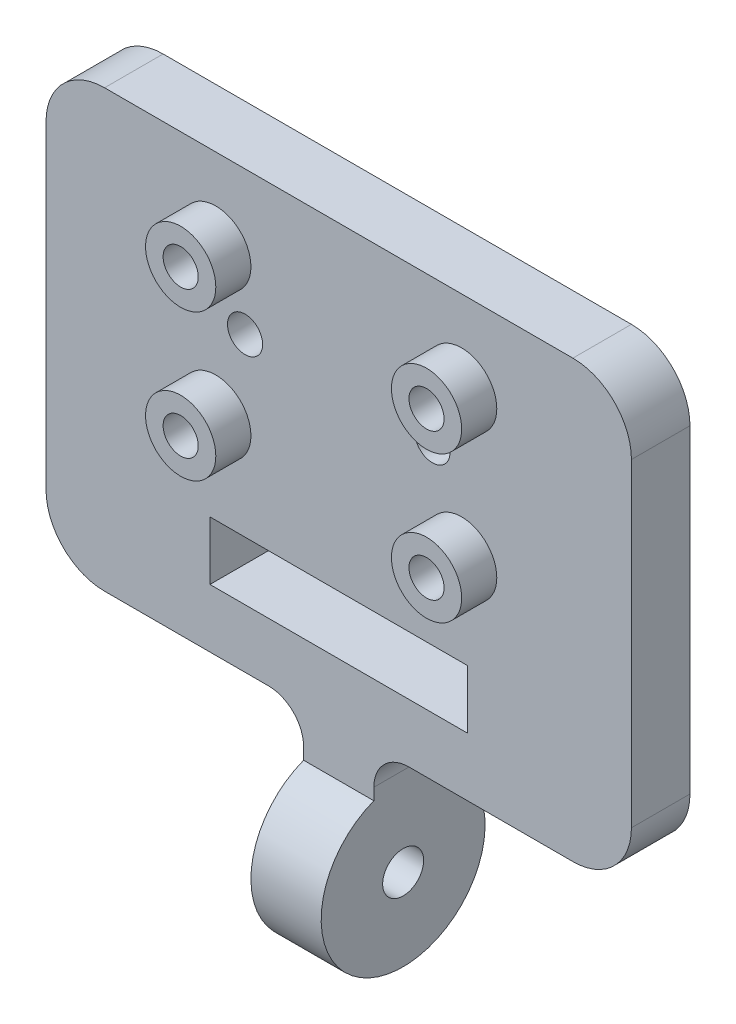
ISO-10303-21;
HEADER;
FILE_DESCRIPTION(('STEP AP214'),'2;1');
FILE_NAME('part.step','',(''),(''),'','','');
FILE_SCHEMA(('AUTOMOTIVE_DESIGN { 1 0 10303 214 1 1 1 1 }'));
ENDSEC;
DATA;
#1=APPLICATION_CONTEXT('core data for automotive mechanical design processes');
#2=APPLICATION_PROTOCOL_DEFINITION('international standard','automotive_design',2000,#1);
#3=PRODUCT_CONTEXT('',#1,'mechanical');
#4=PRODUCT('Part','Part','',(#3));
#5=PRODUCT_RELATED_PRODUCT_CATEGORY('part','',(#4));
#6=PRODUCT_DEFINITION_FORMATION('','',#4);
#7=PRODUCT_DEFINITION_CONTEXT('part definition',#1,'design');
#8=PRODUCT_DEFINITION('design','',#6,#7);
#9=PRODUCT_DEFINITION_SHAPE('','',#8);
#10=(LENGTH_UNIT() NAMED_UNIT(*) SI_UNIT(.MILLI.,.METRE.));
#11=(NAMED_UNIT(*) PLANE_ANGLE_UNIT() SI_UNIT($,.RADIAN.));
#12=(NAMED_UNIT(*) SI_UNIT($,.STERADIAN.) SOLID_ANGLE_UNIT());
#13=UNCERTAINTY_MEASURE_WITH_UNIT(LENGTH_MEASURE(1.E-05),#10,'distance_accuracy_value','');
#14=(GEOMETRIC_REPRESENTATION_CONTEXT(3) GLOBAL_UNCERTAINTY_ASSIGNED_CONTEXT((#13)) GLOBAL_UNIT_ASSIGNED_CONTEXT((#10,
#11,#12)) REPRESENTATION_CONTEXT('',''));
#15=CARTESIAN_POINT('',(0.,0.,0.));
#16=DIRECTION('',(0.,0.,1.));
#17=DIRECTION('',(1.,0.,0.));
#18=AXIS2_PLACEMENT_3D('',#15,#16,#17);
#19=CARTESIAN_POINT('',(-11.1229946524064,-36.2352941176471,5.));
#20=DIRECTION('',(0.,1.,0.));
#21=DIRECTION('',(0.,0.,1.));
#22=AXIS2_PLACEMENT_3D('',#19,#20,#21);
#23=PLANE('',#22);
#24=DIRECTION('',(1.,0.,0.));
#25=VECTOR('',#24,1.);
#26=CARTESIAN_POINT('',(-11.1229946524064,-36.2352941176471,5.));
#27=LINE('',#26,#25);
#28=CARTESIAN_POINT('',(19.8770053475936,-36.2352941176471,5.));
#29=VERTEX_POINT('',#28);
#30=CARTESIAN_POINT('',(33.8770053475936,-36.2352941176471,5.));
#31=VERTEX_POINT('',#30);
#32=EDGE_CURVE('E315',#29,#31,#27,.T.);
#33=ORIENTED_EDGE('',*,*,#32,.F.);
#34=DIRECTION('',(0.,0.,1.));
#35=VECTOR('',#34,1.);
#36=CARTESIAN_POINT('',(19.8770053475936,-36.2352941176471,0.));
#37=LINE('',#36,#35);
#38=CARTESIAN_POINT('',(19.8770053475936,-36.2352941176471,0.));
#39=VERTEX_POINT('',#38);
#40=EDGE_CURVE('E405',#29,#39,#37,.F.);
#41=ORIENTED_EDGE('',*,*,#40,.T.);
#42=DIRECTION('',(1.,0.,0.));
#43=VECTOR('',#42,1.);
#44=CARTESIAN_POINT('',(-11.1229946524064,-36.2352941176471,0.));
#45=LINE('',#44,#43);
#46=CARTESIAN_POINT('',(33.8770053475936,-36.2352941176471,0.));
#47=VERTEX_POINT('',#46);
#48=EDGE_CURVE('E329',#39,#47,#45,.T.);
#49=ORIENTED_EDGE('',*,*,#48,.T.);
#50=DIRECTION('',(0.,0.,-1.));
#51=VECTOR('',#50,1.);
#52=CARTESIAN_POINT('',(33.8770053475936,-36.2352941176471,5.));
#53=LINE('',#52,#51);
#54=EDGE_CURVE('E361',#47,#31,#53,.F.);
#55=ORIENTED_EDGE('',*,*,#54,.T.);
#56=EDGE_LOOP('',(#33,#41,#49,#55));
#57=FACE_BOUND('',#56,.T.);
#58=ADVANCED_FACE('F41',(#57),#23,.F.);
#59=CARTESIAN_POINT('',(-6.12299465240641,-36.2352941176471,0.));
#60=VERTEX_POINT('',#59);
#61=CARTESIAN_POINT('',(7.87700534759359,-36.2352941176471,0.));
#62=VERTEX_POINT('',#61);
#63=EDGE_CURVE('E330',#60,#62,#45,.T.);
#64=ORIENTED_EDGE('',*,*,#63,.T.);
#65=DIRECTION('',(0.,0.,-1.));
#66=VECTOR('',#65,1.);
#67=CARTESIAN_POINT('',(7.87700534759358,-36.2352941176471,5.));
#68=LINE('',#67,#66);
#69=CARTESIAN_POINT('',(7.87700534759358,-36.2352941176471,5.));
#70=VERTEX_POINT('',#69);
#71=EDGE_CURVE('E398',#62,#70,#68,.F.);
#72=ORIENTED_EDGE('',*,*,#71,.T.);
#73=CARTESIAN_POINT('',(-6.12299465240641,-36.2352941176471,5.));
#74=VERTEX_POINT('',#73);
#75=EDGE_CURVE('E317',#74,#70,#27,.T.);
#76=ORIENTED_EDGE('',*,*,#75,.F.);
#77=DIRECTION('',(0.,0.,-1.));
#78=VECTOR('',#77,1.);
#79=CARTESIAN_POINT('',(-6.12299465240641,-36.2352941176471,5.));
#80=LINE('',#79,#78);
#81=EDGE_CURVE('E390',#74,#60,#80,.T.);
#82=ORIENTED_EDGE('',*,*,#81,.T.);
#83=EDGE_LOOP('',(#64,#72,#76,#82));
#84=FACE_BOUND('',#83,.T.);
#85=ADVANCED_FACE('F487',(#84),#23,.F.);
#86=CARTESIAN_POINT('',(-11.1229946524064,11.7647058823529,5.));
#87=DIRECTION('',(1.,0.,0.));
#88=DIRECTION('',(0.,1.,0.));
#89=AXIS2_PLACEMENT_3D('',#86,#87,#88);
#90=PLANE('',#89);
#91=DIRECTION('',(0.,-1.,0.));
#92=VECTOR('',#91,1.);
#93=CARTESIAN_POINT('',(-11.1229946524064,11.7647058823529,5.));
#94=LINE('',#93,#92);
#95=CARTESIAN_POINT('',(-11.1229946524064,-3.99341314703661,5.));
#96=VERTEX_POINT('',#95);
#97=CARTESIAN_POINT('',(-11.1229946524064,-31.2352941176471,5.));
#98=VERTEX_POINT('',#97);
#99=EDGE_CURVE('E311',#96,#98,#94,.T.);
#100=ORIENTED_EDGE('',*,*,#99,.F.);
#101=DIRECTION('',(0.,0.,1.));
#102=VECTOR('',#101,1.);
#103=CARTESIAN_POINT('',(-11.1229946524064,-3.99341314703661,5.));
#104=LINE('',#103,#102);
#105=CARTESIAN_POINT('',(-11.1229946524064,-3.99341314703661,0.));
#106=VERTEX_POINT('',#105);
#107=EDGE_CURVE('E387',#96,#106,#104,.F.);
#108=ORIENTED_EDGE('',*,*,#107,.T.);
#109=DIRECTION('',(0.,-1.,0.));
#110=VECTOR('',#109,1.);
#111=CARTESIAN_POINT('',(-11.1229946524064,11.7647058823529,0.));
#112=LINE('',#111,#110);
#113=CARTESIAN_POINT('',(-11.1229946524064,-31.2352941176471,0.));
#114=VERTEX_POINT('',#113);
#115=EDGE_CURVE('E307',#106,#114,#112,.T.);
#116=ORIENTED_EDGE('',*,*,#115,.T.);
#117=DIRECTION('',(0.,0.,-1.));
#118=VECTOR('',#117,1.);
#119=CARTESIAN_POINT('',(-11.1229946524064,-31.2352941176471,5.));
#120=LINE('',#119,#118);
#121=EDGE_CURVE('E384',#114,#98,#120,.F.);
#122=ORIENTED_EDGE('',*,*,#121,.T.);
#123=EDGE_LOOP('',(#100,#108,#116,#122));
#124=FACE_BOUND('',#123,.T.);
#125=ADVANCED_FACE('F478',(#124),#90,.F.);
#126=CARTESIAN_POINT('',(38.8770053475936,11.7647058823529,5.));
#127=DIRECTION('',(-1.,0.,0.));
#128=DIRECTION('',(0.,0.,1.));
#129=AXIS2_PLACEMENT_3D('',#126,#127,#128);
#130=PLANE('',#129);
#131=DIRECTION('',(0.,1.,0.));
#132=VECTOR('',#131,1.);
#133=CARTESIAN_POINT('',(38.8770053475936,11.7647058823529,5.));
#134=LINE('',#133,#132);
#135=CARTESIAN_POINT('',(38.8770053475936,-31.2352941176471,5.));
#136=VERTEX_POINT('',#135);
#137=CARTESIAN_POINT('',(38.8770053475936,-3.99341314703661,5.));
#138=VERTEX_POINT('',#137);
#139=EDGE_CURVE('E321',#136,#138,#134,.T.);
#140=ORIENTED_EDGE('',*,*,#139,.F.);
#141=DIRECTION('',(0.,0.,-1.));
#142=VECTOR('',#141,1.);
#143=CARTESIAN_POINT('',(38.8770053475936,-31.2352941176471,5.));
#144=LINE('',#143,#142);
#145=CARTESIAN_POINT('',(38.8770053475936,-31.2352941176471,0.));
#146=VERTEX_POINT('',#145);
#147=EDGE_CURVE('E344',#136,#146,#144,.T.);
#148=ORIENTED_EDGE('',*,*,#147,.T.);
#149=DIRECTION('',(0.,1.,0.));
#150=VECTOR('',#149,1.);
#151=CARTESIAN_POINT('',(38.8770053475936,11.7647058823529,0.));
#152=LINE('',#151,#150);
#153=CARTESIAN_POINT('',(38.8770053475936,-3.99341314703661,0.));
#154=VERTEX_POINT('',#153);
#155=EDGE_CURVE('E316',#146,#154,#152,.T.);
#156=ORIENTED_EDGE('',*,*,#155,.T.);
#157=DIRECTION('',(0.,0.,1.));
#158=VECTOR('',#157,1.);
#159=CARTESIAN_POINT('',(38.8770053475936,-3.99341314703661,5.));
#160=LINE('',#159,#158);
#161=EDGE_CURVE('E340',#154,#138,#160,.T.);
#162=ORIENTED_EDGE('',*,*,#161,.T.);
#163=EDGE_LOOP('',(#140,#148,#156,#162));
#164=FACE_BOUND('',#163,.T.);
#165=ADVANCED_FACE('F460',(#164),#130,.F.);
#166=CARTESIAN_POINT('',(0.,0.,5.));
#167=DIRECTION('',(0.,0.,1.));
#168=DIRECTION('',(1.,0.,0.));
#169=AXIS2_PLACEMENT_3D('',#166,#167,#168);
#170=PLANE('',#169);
#171=CARTESIAN_POINT('',(21.8770053475936,-11.2352941176471,5.));
#172=DIRECTION('',(0.,0.,1.));
#173=DIRECTION('',(1.,0.,0.));
#174=AXIS2_PLACEMENT_3D('',#171,#172,#173);
#175=CIRCLE('',#174,1.5);
#176=CARTESIAN_POINT('',(23.3770053475936,-11.2352941176471,5.));
#177=VERTEX_POINT('',#176);
#178=EDGE_CURVE('E639',#177,#177,#175,.T.);
#179=ORIENTED_EDGE('',*,*,#178,.F.);
#180=EDGE_LOOP('',(#179));
#181=FACE_BOUND('',#180,.T.);
#182=CARTESIAN_POINT('',(5.87700534759359,-11.2352941176471,5.));
#183=DIRECTION('',(0.,0.,1.));
#184=DIRECTION('',(1.,0.,0.));
#185=AXIS2_PLACEMENT_3D('',#182,#183,#184);
#186=CIRCLE('',#185,1.5);
#187=CARTESIAN_POINT('',(7.37700534759358,-11.2352941176471,5.));
#188=VERTEX_POINT('',#187);
#189=EDGE_CURVE('E644',#188,#188,#186,.T.);
#190=ORIENTED_EDGE('',*,*,#189,.F.);
#191=EDGE_LOOP('',(#190));
#192=FACE_BOUND('',#191,.T.);
#193=DIRECTION('',(0.,-1.,0.));
#194=VECTOR('',#193,1.);
#195=CARTESIAN_POINT('',(2.87700534759359,-26.2352941176471,5.));
#196=LINE('',#195,#194);
#197=CARTESIAN_POINT('',(2.87700534759359,-26.2352941176471,5.));
#198=VERTEX_POINT('',#197);
#199=CARTESIAN_POINT('',(2.87700534759359,-31.2352941176471,5.));
#200=VERTEX_POINT('',#199);
#201=EDGE_CURVE('E57',#198,#200,#196,.T.);
#202=ORIENTED_EDGE('',*,*,#201,.F.);
#203=DIRECTION('',(-1.,0.,0.));
#204=VECTOR('',#203,1.);
#205=CARTESIAN_POINT('',(2.87700534759359,-26.2352941176471,5.));
#206=LINE('',#205,#204);
#207=CARTESIAN_POINT('',(24.8770053475936,-26.2352941176471,5.));
#208=VERTEX_POINT('',#207);
#209=EDGE_CURVE('E188',#208,#198,#206,.T.);
#210=ORIENTED_EDGE('',*,*,#209,.F.);
#211=DIRECTION('',(0.,1.,0.));
#212=VECTOR('',#211,1.);
#213=CARTESIAN_POINT('',(24.8770053475936,-26.2352941176471,5.));
#214=LINE('',#213,#212);
#215=CARTESIAN_POINT('',(24.8770053475936,-31.2352941176471,5.));
#216=VERTEX_POINT('',#215);
#217=EDGE_CURVE('E170',#216,#208,#214,.T.);
#218=ORIENTED_EDGE('',*,*,#217,.F.);
#219=DIRECTION('',(1.,0.,0.));
#220=VECTOR('',#219,1.);
#221=CARTESIAN_POINT('',(2.87700534759359,-31.2352941176471,5.));
#222=LINE('',#221,#220);
#223=EDGE_CURVE('E180',#200,#216,#222,.T.);
#224=ORIENTED_EDGE('',*,*,#223,.F.);
#225=EDGE_LOOP('',(#202,#210,#218,#224));
#226=FACE_BOUND('',#225,.T.);
#227=DIRECTION('',(0.,1.,0.));
#228=VECTOR('',#227,1.);
#229=CARTESIAN_POINT('',(16.8770053475936,-40.2352941176471,5.));
#230=LINE('',#229,#228);
#231=CARTESIAN_POINT('',(16.8770053475936,-40.2352941176471,5.));
#232=VERTEX_POINT('',#231);
#233=CARTESIAN_POINT('',(16.8770053475936,-39.2352941176471,5.));
#234=VERTEX_POINT('',#233);
#235=EDGE_CURVE('E258',#232,#234,#230,.T.);
#236=ORIENTED_EDGE('',*,*,#235,.T.);
#237=CARTESIAN_POINT('',(19.8770053475936,-39.2352941176471,5.));
#238=DIRECTION('',(0.,0.,1.));
#239=DIRECTION('',(1.,0.,0.));
#240=AXIS2_PLACEMENT_3D('',#237,#238,#239);
#241=CIRCLE('',#240,3.);
#242=EDGE_CURVE('E414',#234,#29,#241,.F.);
#243=ORIENTED_EDGE('',*,*,#242,.T.);
#244=ORIENTED_EDGE('',*,*,#32,.T.);
#245=CARTESIAN_POINT('',(33.8770053475936,-31.2352941176471,5.));
#246=DIRECTION('',(0.,0.,1.));
#247=DIRECTION('',(1.,0.,0.));
#248=AXIS2_PLACEMENT_3D('',#245,#246,#247);
#249=CIRCLE('',#248,5.);
#250=EDGE_CURVE('E374',#31,#136,#249,.T.);
#251=ORIENTED_EDGE('',*,*,#250,.T.);
#252=ORIENTED_EDGE('',*,*,#139,.T.);
#253=CARTESIAN_POINT('',(33.8770053475936,-3.99341314703661,5.));
#254=DIRECTION('',(0.,0.,1.));
#255=DIRECTION('',(1.,0.,0.));
#256=AXIS2_PLACEMENT_3D('',#253,#254,#255);
#257=CIRCLE('',#256,5.);
#258=CARTESIAN_POINT('',(33.8770053475936,1.00658685296339,5.));
#259=VERTEX_POINT('',#258);
#260=EDGE_CURVE('E371',#138,#259,#257,.T.);
#261=ORIENTED_EDGE('',*,*,#260,.T.);
#262=DIRECTION('',(1.,0.,0.));
#263=VECTOR('',#262,1.);
#264=CARTESIAN_POINT('',(38.8770053475936,1.00658685296339,5.));
#265=LINE('',#264,#263);
#266=CARTESIAN_POINT('',(-6.1229946524064,1.00658685296339,5.));
#267=VERTEX_POINT('',#266);
#268=EDGE_CURVE('E218',#267,#259,#265,.T.);
#269=ORIENTED_EDGE('',*,*,#268,.F.);
#270=CARTESIAN_POINT('',(-6.12299465240641,-3.99341314703661,5.));
#271=DIRECTION('',(0.,0.,1.));
#272=DIRECTION('',(1.,0.,0.));
#273=AXIS2_PLACEMENT_3D('',#270,#271,#272);
#274=CIRCLE('',#273,5.);
#275=EDGE_CURVE('E368',#267,#96,#274,.T.);
#276=ORIENTED_EDGE('',*,*,#275,.T.);
#277=ORIENTED_EDGE('',*,*,#99,.T.);
#278=CARTESIAN_POINT('',(-6.12299465240641,-31.2352941176471,5.));
#279=DIRECTION('',(0.,0.,1.));
#280=DIRECTION('',(1.,0.,0.));
#281=AXIS2_PLACEMENT_3D('',#278,#279,#280);
#282=CIRCLE('',#281,5.);
#283=EDGE_CURVE('E365',#98,#74,#282,.T.);
#284=ORIENTED_EDGE('',*,*,#283,.T.);
#285=ORIENTED_EDGE('',*,*,#75,.T.);
#286=CARTESIAN_POINT('',(7.87700534759358,-39.2352941176471,5.));
#287=DIRECTION('',(0.,0.,1.));
#288=DIRECTION('',(1.,0.,0.));
#289=AXIS2_PLACEMENT_3D('',#286,#287,#288);
#290=CIRCLE('',#289,3.);
#291=CARTESIAN_POINT('',(10.8770053475936,-39.2352941176471,5.));
#292=VERTEX_POINT('',#291);
#293=EDGE_CURVE('E411',#70,#292,#290,.F.);
#294=ORIENTED_EDGE('',*,*,#293,.T.);
#295=DIRECTION('',(0.,1.,0.));
#296=VECTOR('',#295,1.);
#297=CARTESIAN_POINT('',(10.8770053475936,-40.2352941176471,5.));
#298=LINE('',#297,#296);
#299=CARTESIAN_POINT('',(10.8770053475936,-40.2352941176471,5.));
#300=VERTEX_POINT('',#299);
#301=EDGE_CURVE('E254',#300,#292,#298,.T.);
#302=ORIENTED_EDGE('',*,*,#301,.F.);
#303=DIRECTION('',(-1.,0.,0.));
#304=VECTOR('',#303,1.);
#305=CARTESIAN_POINT('',(16.8770053475936,-40.2352941176471,5.));
#306=LINE('',#305,#304);
#307=EDGE_CURVE('E235',#232,#300,#306,.T.);
#308=ORIENTED_EDGE('',*,*,#307,.F.);
#309=EDGE_LOOP('',(#236,#243,#244,#251,#252,#261,#269,#276,#277,#284,#285,#294,#302,#308));
#310=FACE_BOUND('',#309,.T.);
#311=CARTESIAN_POINT('',(24.3770053475936,-18.4852941176471,5.));
#312=DIRECTION('',(0.,0.,1.));
#313=DIRECTION('',(1.,0.,0.));
#314=AXIS2_PLACEMENT_3D('',#311,#312,#313);
#315=CIRCLE('',#314,3.);
#316=CARTESIAN_POINT('',(27.3770053475936,-18.4852941176471,5.));
#317=VERTEX_POINT('',#316);
#318=EDGE_CURVE('E266',#317,#317,#315,.T.);
#319=ORIENTED_EDGE('',*,*,#318,.F.);
#320=EDGE_LOOP('',(#319));
#321=FACE_BOUND('',#320,.T.);
#322=CARTESIAN_POINT('',(24.3770053475936,-5.98529411764706,5.));
#323=DIRECTION('',(0.,0.,1.));
#324=DIRECTION('',(1.,0.,0.));
#325=AXIS2_PLACEMENT_3D('',#322,#323,#324);
#326=CIRCLE('',#325,3.);
#327=CARTESIAN_POINT('',(27.3770053475936,-5.98529411764706,5.));
#328=VERTEX_POINT('',#327);
#329=EDGE_CURVE('E278',#328,#328,#326,.T.);
#330=ORIENTED_EDGE('',*,*,#329,.F.);
#331=EDGE_LOOP('',(#330));
#332=FACE_BOUND('',#331,.T.);
#333=CARTESIAN_POINT('',(3.37700534759359,-18.4852941176471,5.));
#334=DIRECTION('',(0.,0.,1.));
#335=DIRECTION('',(1.,0.,0.));
#336=AXIS2_PLACEMENT_3D('',#333,#334,#335);
#337=CIRCLE('',#336,3.);
#338=CARTESIAN_POINT('',(6.37700534759359,-18.4852941176471,5.));
#339=VERTEX_POINT('',#338);
#340=EDGE_CURVE('E290',#339,#339,#337,.T.);
#341=ORIENTED_EDGE('',*,*,#340,.F.);
#342=EDGE_LOOP('',(#341));
#343=FACE_BOUND('',#342,.T.);
#344=CARTESIAN_POINT('',(3.37700534759359,-5.98529411764706,5.));
#345=DIRECTION('',(0.,0.,1.));
#346=DIRECTION('',(1.,0.,0.));
#347=AXIS2_PLACEMENT_3D('',#344,#345,#346);
#348=CIRCLE('',#347,3.);
#349=CARTESIAN_POINT('',(6.37700534759359,-5.98529411764706,5.));
#350=VERTEX_POINT('',#349);
#351=EDGE_CURVE('E302',#350,#350,#348,.T.);
#352=ORIENTED_EDGE('',*,*,#351,.F.);
#353=EDGE_LOOP('',(#352));
#354=FACE_BOUND('',#353,.T.);
#355=ADVANCED_FACE('F185',(#181,#192,#226,#310,#321,#332,#343,#354),#170,.T.);
#356=CARTESIAN_POINT('',(0.,0.,0.));
#357=DIRECTION('',(0.,0.,1.));
#358=DIRECTION('',(1.,0.,0.));
#359=AXIS2_PLACEMENT_3D('',#356,#357,#358);
#360=PLANE('',#359);
#361=CARTESIAN_POINT('',(5.87700534759359,-11.2352941176471,0.));
#362=DIRECTION('',(0.,0.,1.));
#363=DIRECTION('',(1.,0.,0.));
#364=AXIS2_PLACEMENT_3D('',#361,#362,#363);
#365=CIRCLE('',#364,3.);
#366=CARTESIAN_POINT('',(8.87700534759359,-11.2352941176471,0.));
#367=VERTEX_POINT('',#366);
#368=EDGE_CURVE('E11',#367,#367,#365,.F.);
#369=ORIENTED_EDGE('',*,*,#368,.F.);
#370=EDGE_LOOP('',(#369));
#371=FACE_BOUND('',#370,.T.);
#372=CARTESIAN_POINT('',(21.8770053475936,-11.2352941176471,0.));
#373=DIRECTION('',(0.,0.,1.));
#374=DIRECTION('',(1.,0.,0.));
#375=AXIS2_PLACEMENT_3D('',#372,#373,#374);
#376=CIRCLE('',#375,2.99999999999999);
#377=CARTESIAN_POINT('',(24.8770053475936,-11.2352941176471,0.));
#378=VERTEX_POINT('',#377);
#379=EDGE_CURVE('E50',#378,#378,#376,.F.);
#380=ORIENTED_EDGE('',*,*,#379,.F.);
#381=EDGE_LOOP('',(#380));
#382=FACE_BOUND('',#381,.T.);
#383=DIRECTION('',(-1.,0.,0.));
#384=VECTOR('',#383,1.);
#385=CARTESIAN_POINT('',(0.,-26.2352941176471,0.));
#386=LINE('',#385,#384);
#387=CARTESIAN_POINT('',(24.8770053475936,-26.2352941176471,0.));
#388=VERTEX_POINT('',#387);
#389=CARTESIAN_POINT('',(2.87700534759359,-26.2352941176471,0.));
#390=VERTEX_POINT('',#389);
#391=EDGE_CURVE('E425',#388,#390,#386,.T.);
#392=ORIENTED_EDGE('',*,*,#391,.T.);
#393=DIRECTION('',(0.,-1.,0.));
#394=VECTOR('',#393,1.);
#395=CARTESIAN_POINT('',(2.87700534759359,0.,0.));
#396=LINE('',#395,#394);
#397=CARTESIAN_POINT('',(2.87700534759359,-31.2352941176471,0.));
#398=VERTEX_POINT('',#397);
#399=EDGE_CURVE('E429',#390,#398,#396,.T.);
#400=ORIENTED_EDGE('',*,*,#399,.T.);
#401=DIRECTION('',(1.,0.,0.));
#402=VECTOR('',#401,1.);
#403=CARTESIAN_POINT('',(0.,-31.2352941176471,0.));
#404=LINE('',#403,#402);
#405=CARTESIAN_POINT('',(24.8770053475936,-31.2352941176471,0.));
#406=VERTEX_POINT('',#405);
#407=EDGE_CURVE('E420',#398,#406,#404,.T.);
#408=ORIENTED_EDGE('',*,*,#407,.T.);
#409=DIRECTION('',(0.,1.,0.));
#410=VECTOR('',#409,1.);
#411=CARTESIAN_POINT('',(24.8770053475936,0.,0.));
#412=LINE('',#411,#410);
#413=EDGE_CURVE('E173',#406,#388,#412,.T.);
#414=ORIENTED_EDGE('',*,*,#413,.T.);
#415=EDGE_LOOP('',(#392,#400,#408,#414));
#416=FACE_BOUND('',#415,.T.);
#417=CARTESIAN_POINT('',(3.37700534759359,-18.4852941176471,0.));
#418=DIRECTION('',(0.,0.,1.));
#419=DIRECTION('',(1.,0.,0.));
#420=AXIS2_PLACEMENT_3D('',#417,#418,#419);
#421=CIRCLE('',#420,1.5);
#422=CARTESIAN_POINT('',(4.87700534759359,-18.4852941176471,0.));
#423=VERTEX_POINT('',#422);
#424=EDGE_CURVE('E210',#423,#423,#421,.T.);
#425=ORIENTED_EDGE('',*,*,#424,.T.);
#426=EDGE_LOOP('',(#425));
#427=FACE_BOUND('',#426,.T.);
#428=CARTESIAN_POINT('',(24.3770053475936,-18.4852941176471,0.));
#429=DIRECTION('',(0.,0.,1.));
#430=DIRECTION('',(1.,0.,0.));
#431=AXIS2_PLACEMENT_3D('',#428,#429,#430);
#432=CIRCLE('',#431,1.5);
#433=CARTESIAN_POINT('',(25.8770053475936,-18.4852941176471,0.));
#434=VERTEX_POINT('',#433);
#435=EDGE_CURVE('E198',#434,#434,#432,.T.);
#436=ORIENTED_EDGE('',*,*,#435,.T.);
#437=EDGE_LOOP('',(#436));
#438=FACE_BOUND('',#437,.T.);
#439=CARTESIAN_POINT('',(24.3770053475936,-5.98529411764706,0.));
#440=DIRECTION('',(0.,0.,1.));
#441=DIRECTION('',(1.,0.,0.));
#442=AXIS2_PLACEMENT_3D('',#439,#440,#441);
#443=CIRCLE('',#442,1.5);
#444=CARTESIAN_POINT('',(25.8770053475936,-5.98529411764706,0.));
#445=VERTEX_POINT('',#444);
#446=EDGE_CURVE('E206',#445,#445,#443,.T.);
#447=ORIENTED_EDGE('',*,*,#446,.T.);
#448=EDGE_LOOP('',(#447));
#449=FACE_BOUND('',#448,.T.);
#450=CARTESIAN_POINT('',(3.37700534759359,-5.98529411764706,0.));
#451=DIRECTION('',(0.,0.,1.));
#452=DIRECTION('',(1.,0.,0.));
#453=AXIS2_PLACEMENT_3D('',#450,#451,#452);
#454=CIRCLE('',#453,1.5);
#455=CARTESIAN_POINT('',(4.87700534759359,-5.98529411764706,0.));
#456=VERTEX_POINT('',#455);
#457=EDGE_CURVE('E214',#456,#456,#454,.T.);
#458=ORIENTED_EDGE('',*,*,#457,.T.);
#459=EDGE_LOOP('',(#458));
#460=FACE_BOUND('',#459,.T.);
#461=ORIENTED_EDGE('',*,*,#155,.F.);
#462=CARTESIAN_POINT('',(33.8770053475936,-31.2352941176471,0.));
#463=DIRECTION('',(0.,0.,1.));
#464=DIRECTION('',(1.,0.,0.));
#465=AXIS2_PLACEMENT_3D('',#462,#463,#464);
#466=CIRCLE('',#465,5.);
#467=EDGE_CURVE('E357',#146,#47,#466,.F.);
#468=ORIENTED_EDGE('',*,*,#467,.T.);
#469=ORIENTED_EDGE('',*,*,#48,.F.);
#470=CARTESIAN_POINT('',(19.8770053475936,-39.2352941176471,0.));
#471=DIRECTION('',(0.,0.,1.));
#472=DIRECTION('',(1.,0.,0.));
#473=AXIS2_PLACEMENT_3D('',#470,#471,#472);
#474=CIRCLE('',#473,3.);
#475=CARTESIAN_POINT('',(16.8770053475936,-39.2352941176471,0.));
#476=VERTEX_POINT('',#475);
#477=EDGE_CURVE('E417',#39,#476,#474,.T.);
#478=ORIENTED_EDGE('',*,*,#477,.T.);
#479=DIRECTION('',(0.,1.,0.));
#480=VECTOR('',#479,1.);
#481=CARTESIAN_POINT('',(16.8770053475936,-40.2352941176471,0.));
#482=LINE('',#481,#480);
#483=CARTESIAN_POINT('',(16.8770053475936,-40.2352941176471,0.));
#484=VERTEX_POINT('',#483);
#485=EDGE_CURVE('E246',#484,#476,#482,.T.);
#486=ORIENTED_EDGE('',*,*,#485,.F.);
#487=DIRECTION('',(1.,0.,0.));
#488=VECTOR('',#487,1.);
#489=CARTESIAN_POINT('',(16.8770053475936,-40.2352941176471,0.));
#490=LINE('',#489,#488);
#491=CARTESIAN_POINT('',(10.8770053475936,-40.2352941176471,0.));
#492=VERTEX_POINT('',#491);
#493=EDGE_CURVE('E242',#492,#484,#490,.T.);
#494=ORIENTED_EDGE('',*,*,#493,.F.);
#495=DIRECTION('',(0.,1.,0.));
#496=VECTOR('',#495,1.);
#497=CARTESIAN_POINT('',(10.8770053475936,-40.2352941176471,0.));
#498=LINE('',#497,#496);
#499=CARTESIAN_POINT('',(10.8770053475936,-39.2352941176471,0.));
#500=VERTEX_POINT('',#499);
#501=EDGE_CURVE('E250',#492,#500,#498,.T.);
#502=ORIENTED_EDGE('',*,*,#501,.T.);
#503=CARTESIAN_POINT('',(7.87700534759359,-39.2352941176471,0.));
#504=DIRECTION('',(0.,0.,1.));
#505=DIRECTION('',(1.,0.,0.));
#506=AXIS2_PLACEMENT_3D('',#503,#504,#505);
#507=CIRCLE('',#506,3.);
#508=EDGE_CURVE('E408',#500,#62,#507,.T.);
#509=ORIENTED_EDGE('',*,*,#508,.T.);
#510=ORIENTED_EDGE('',*,*,#63,.F.);
#511=CARTESIAN_POINT('',(-6.12299465240641,-31.2352941176471,0.));
#512=DIRECTION('',(0.,0.,1.));
#513=DIRECTION('',(1.,0.,0.));
#514=AXIS2_PLACEMENT_3D('',#511,#512,#513);
#515=CIRCLE('',#514,5.);
#516=EDGE_CURVE('E348',#60,#114,#515,.F.);
#517=ORIENTED_EDGE('',*,*,#516,.T.);
#518=ORIENTED_EDGE('',*,*,#115,.F.);
#519=CARTESIAN_POINT('',(-6.12299465240641,-3.99341314703661,0.));
#520=DIRECTION('',(0.,0.,1.));
#521=DIRECTION('',(1.,0.,0.));
#522=AXIS2_PLACEMENT_3D('',#519,#520,#521);
#523=CIRCLE('',#522,5.);
#524=CARTESIAN_POINT('',(-6.12299465240641,1.00658685296339,0.));
#525=VERTEX_POINT('',#524);
#526=EDGE_CURVE('E351',#106,#525,#523,.F.);
#527=ORIENTED_EDGE('',*,*,#526,.T.);
#528=DIRECTION('',(1.,0.,0.));
#529=VECTOR('',#528,1.);
#530=CARTESIAN_POINT('',(0.,1.00658685296339,0.));
#531=LINE('',#530,#529);
#532=CARTESIAN_POINT('',(33.8770053475936,1.00658685296339,0.));
#533=VERTEX_POINT('',#532);
#534=EDGE_CURVE('E325',#525,#533,#531,.T.);
#535=ORIENTED_EDGE('',*,*,#534,.T.);
#536=CARTESIAN_POINT('',(33.8770053475936,-3.99341314703661,0.));
#537=DIRECTION('',(0.,0.,1.));
#538=DIRECTION('',(1.,0.,0.));
#539=AXIS2_PLACEMENT_3D('',#536,#537,#538);
#540=CIRCLE('',#539,5.);
#541=EDGE_CURVE('E354',#533,#154,#540,.F.);
#542=ORIENTED_EDGE('',*,*,#541,.T.);
#543=EDGE_LOOP('',(#461,#468,#469,#478,#486,#494,#502,#509,#510,#517,#518,#527,#535,#542));
#544=FACE_BOUND('',#543,.T.);
#545=ADVANCED_FACE('F438',(#371,#382,#416,#427,#438,#449,#460,#544),#360,.F.);
#546=CARTESIAN_POINT('',(3.37700534759359,-5.98529411764706,8.));
#547=DIRECTION('',(0.,0.,1.));
#548=DIRECTION('',(1.,0.,0.));
#549=AXIS2_PLACEMENT_3D('',#546,#547,#548);
#550=PLANE('',#549);
#551=CARTESIAN_POINT('',(3.37700534759359,-5.98529411764706,8.));
#552=DIRECTION('',(0.,0.,1.));
#553=DIRECTION('',(1.,0.,0.));
#554=AXIS2_PLACEMENT_3D('',#551,#552,#553);
#555=CIRCLE('',#554,3.);
#556=CARTESIAN_POINT('',(6.37700534759359,-5.98529411764706,8.));
#557=VERTEX_POINT('',#556);
#558=EDGE_CURVE('E303',#557,#557,#555,.T.);
#559=ORIENTED_EDGE('',*,*,#558,.T.);
#560=EDGE_LOOP('',(#559));
#561=FACE_BOUND('',#560,.T.);
#562=CARTESIAN_POINT('',(3.37700534759359,-5.98529411764706,8.));
#563=DIRECTION('',(0.,0.,1.));
#564=DIRECTION('',(1.,0.,0.));
#565=AXIS2_PLACEMENT_3D('',#562,#563,#564);
#566=CIRCLE('',#565,1.5);
#567=CARTESIAN_POINT('',(4.87700534759359,-5.98529411764706,8.));
#568=VERTEX_POINT('',#567);
#569=EDGE_CURVE('E295',#568,#568,#566,.T.);
#570=ORIENTED_EDGE('',*,*,#569,.F.);
#571=EDGE_LOOP('',(#570));
#572=FACE_BOUND('',#571,.T.);
#573=ADVANCED_FACE('F441',(#561,#572),#550,.T.);
#574=CARTESIAN_POINT('',(3.37700534759359,-5.98529411764706,8.));
#575=DIRECTION('',(0.,0.,-1.));
#576=DIRECTION('',(-1.,0.,0.));
#577=AXIS2_PLACEMENT_3D('',#574,#575,#576);
#578=CYLINDRICAL_SURFACE('',#577,3.);
#579=ORIENTED_EDGE('',*,*,#558,.F.);
#580=EDGE_LOOP('',(#579));
#581=FACE_BOUND('',#580,.T.);
#582=ORIENTED_EDGE('',*,*,#351,.T.);
#583=EDGE_LOOP('',(#582));
#584=FACE_BOUND('',#583,.T.);
#585=ADVANCED_FACE('F544',(#581,#584),#578,.T.);
#586=CARTESIAN_POINT('',(3.37700534759359,-5.98529411764706,8.));
#587=DIRECTION('',(0.,0.,-1.));
#588=DIRECTION('',(-1.,0.,0.));
#589=AXIS2_PLACEMENT_3D('',#586,#587,#588);
#590=CYLINDRICAL_SURFACE('',#589,1.5);
#591=ORIENTED_EDGE('',*,*,#569,.T.);
#592=EDGE_LOOP('',(#591));
#593=FACE_BOUND('',#592,.T.);
#594=ORIENTED_EDGE('',*,*,#457,.F.);
#595=EDGE_LOOP('',(#594));
#596=FACE_BOUND('',#595,.T.);
#597=ADVANCED_FACE('F547',(#593,#596),#590,.F.);
#598=CARTESIAN_POINT('',(3.37700534759359,-18.4852941176471,8.));
#599=DIRECTION('',(0.,0.,1.));
#600=DIRECTION('',(1.,0.,0.));
#601=AXIS2_PLACEMENT_3D('',#598,#599,#600);
#602=PLANE('',#601);
#603=CARTESIAN_POINT('',(3.37700534759359,-18.4852941176471,8.));
#604=DIRECTION('',(0.,0.,1.));
#605=DIRECTION('',(1.,0.,0.));
#606=AXIS2_PLACEMENT_3D('',#603,#604,#605);
#607=CIRCLE('',#606,3.);
#608=CARTESIAN_POINT('',(6.37700534759359,-18.4852941176471,8.));
#609=VERTEX_POINT('',#608);
#610=EDGE_CURVE('E291',#609,#609,#607,.T.);
#611=ORIENTED_EDGE('',*,*,#610,.T.);
#612=EDGE_LOOP('',(#611));
#613=FACE_BOUND('',#612,.T.);
#614=CARTESIAN_POINT('',(3.37700534759359,-18.4852941176471,8.));
#615=DIRECTION('',(0.,0.,1.));
#616=DIRECTION('',(1.,0.,0.));
#617=AXIS2_PLACEMENT_3D('',#614,#615,#616);
#618=CIRCLE('',#617,1.5);
#619=CARTESIAN_POINT('',(4.87700534759359,-18.4852941176471,8.));
#620=VERTEX_POINT('',#619);
#621=EDGE_CURVE('E283',#620,#620,#618,.T.);
#622=ORIENTED_EDGE('',*,*,#621,.F.);
#623=EDGE_LOOP('',(#622));
#624=FACE_BOUND('',#623,.T.);
#625=ADVANCED_FACE('F554',(#613,#624),#602,.T.);
#626=CARTESIAN_POINT('',(3.37700534759359,-18.4852941176471,8.));
#627=DIRECTION('',(0.,0.,-1.));
#628=DIRECTION('',(-1.,0.,0.));
#629=AXIS2_PLACEMENT_3D('',#626,#627,#628);
#630=CYLINDRICAL_SURFACE('',#629,3.);
#631=ORIENTED_EDGE('',*,*,#610,.F.);
#632=EDGE_LOOP('',(#631));
#633=FACE_BOUND('',#632,.T.);
#634=ORIENTED_EDGE('',*,*,#340,.T.);
#635=EDGE_LOOP('',(#634));
#636=FACE_BOUND('',#635,.T.);
#637=ADVANCED_FACE('F556',(#633,#636),#630,.T.);
#638=CARTESIAN_POINT('',(3.37700534759359,-18.4852941176471,8.));
#639=DIRECTION('',(0.,0.,-1.));
#640=DIRECTION('',(-1.,0.,0.));
#641=AXIS2_PLACEMENT_3D('',#638,#639,#640);
#642=CYLINDRICAL_SURFACE('',#641,1.5);
#643=ORIENTED_EDGE('',*,*,#621,.T.);
#644=EDGE_LOOP('',(#643));
#645=FACE_BOUND('',#644,.T.);
#646=ORIENTED_EDGE('',*,*,#424,.F.);
#647=EDGE_LOOP('',(#646));
#648=FACE_BOUND('',#647,.T.);
#649=ADVANCED_FACE('F559',(#645,#648),#642,.F.);
#650=CARTESIAN_POINT('',(24.3770053475936,-5.98529411764706,8.));
#651=DIRECTION('',(0.,0.,1.));
#652=DIRECTION('',(1.,0.,0.));
#653=AXIS2_PLACEMENT_3D('',#650,#651,#652);
#654=PLANE('',#653);
#655=CARTESIAN_POINT('',(24.3770053475936,-5.98529411764706,8.));
#656=DIRECTION('',(0.,0.,1.));
#657=DIRECTION('',(1.,0.,0.));
#658=AXIS2_PLACEMENT_3D('',#655,#656,#657);
#659=CIRCLE('',#658,3.);
#660=CARTESIAN_POINT('',(27.3770053475936,-5.98529411764706,8.));
#661=VERTEX_POINT('',#660);
#662=EDGE_CURVE('E279',#661,#661,#659,.T.);
#663=ORIENTED_EDGE('',*,*,#662,.T.);
#664=EDGE_LOOP('',(#663));
#665=FACE_BOUND('',#664,.T.);
#666=CARTESIAN_POINT('',(24.3770053475936,-5.98529411764706,8.));
#667=DIRECTION('',(0.,0.,1.));
#668=DIRECTION('',(1.,0.,0.));
#669=AXIS2_PLACEMENT_3D('',#666,#667,#668);
#670=CIRCLE('',#669,1.5);
#671=CARTESIAN_POINT('',(25.8770053475936,-5.98529411764706,8.));
#672=VERTEX_POINT('',#671);
#673=EDGE_CURVE('E271',#672,#672,#670,.T.);
#674=ORIENTED_EDGE('',*,*,#673,.F.);
#675=EDGE_LOOP('',(#674));
#676=FACE_BOUND('',#675,.T.);
#677=ADVANCED_FACE('F566',(#665,#676),#654,.T.);
#678=CARTESIAN_POINT('',(24.3770053475936,-5.98529411764706,8.));
#679=DIRECTION('',(0.,0.,-1.));
#680=DIRECTION('',(-1.,0.,0.));
#681=AXIS2_PLACEMENT_3D('',#678,#679,#680);
#682=CYLINDRICAL_SURFACE('',#681,3.);
#683=ORIENTED_EDGE('',*,*,#662,.F.);
#684=EDGE_LOOP('',(#683));
#685=FACE_BOUND('',#684,.T.);
#686=ORIENTED_EDGE('',*,*,#329,.T.);
#687=EDGE_LOOP('',(#686));
#688=FACE_BOUND('',#687,.T.);
#689=ADVANCED_FACE('F568',(#685,#688),#682,.T.);
#690=CARTESIAN_POINT('',(24.3770053475936,-5.98529411764706,8.));
#691=DIRECTION('',(0.,0.,-1.));
#692=DIRECTION('',(-1.,0.,0.));
#693=AXIS2_PLACEMENT_3D('',#690,#691,#692);
#694=CYLINDRICAL_SURFACE('',#693,1.5);
#695=ORIENTED_EDGE('',*,*,#673,.T.);
#696=EDGE_LOOP('',(#695));
#697=FACE_BOUND('',#696,.T.);
#698=ORIENTED_EDGE('',*,*,#446,.F.);
#699=EDGE_LOOP('',(#698));
#700=FACE_BOUND('',#699,.T.);
#701=ADVANCED_FACE('F571',(#697,#700),#694,.F.);
#702=CARTESIAN_POINT('',(24.3770053475936,-18.4852941176471,8.));
#703=DIRECTION('',(0.,0.,1.));
#704=DIRECTION('',(1.,0.,0.));
#705=AXIS2_PLACEMENT_3D('',#702,#703,#704);
#706=PLANE('',#705);
#707=CARTESIAN_POINT('',(24.3770053475936,-18.4852941176471,8.));
#708=DIRECTION('',(0.,0.,1.));
#709=DIRECTION('',(1.,0.,0.));
#710=AXIS2_PLACEMENT_3D('',#707,#708,#709);
#711=CIRCLE('',#710,3.);
#712=CARTESIAN_POINT('',(27.3770053475936,-18.4852941176471,8.));
#713=VERTEX_POINT('',#712);
#714=EDGE_CURVE('E267',#713,#713,#711,.T.);
#715=ORIENTED_EDGE('',*,*,#714,.T.);
#716=EDGE_LOOP('',(#715));
#717=FACE_BOUND('',#716,.T.);
#718=CARTESIAN_POINT('',(24.3770053475936,-18.4852941176471,8.));
#719=DIRECTION('',(0.,0.,1.));
#720=DIRECTION('',(1.,0.,0.));
#721=AXIS2_PLACEMENT_3D('',#718,#719,#720);
#722=CIRCLE('',#721,1.5);
#723=CARTESIAN_POINT('',(25.8770053475936,-18.4852941176471,8.));
#724=VERTEX_POINT('',#723);
#725=EDGE_CURVE('E262',#724,#724,#722,.T.);
#726=ORIENTED_EDGE('',*,*,#725,.F.);
#727=EDGE_LOOP('',(#726));
#728=FACE_BOUND('',#727,.T.);
#729=ADVANCED_FACE('F578',(#717,#728),#706,.T.);
#730=CARTESIAN_POINT('',(24.3770053475936,-18.4852941176471,8.));
#731=DIRECTION('',(0.,0.,-1.));
#732=DIRECTION('',(-1.,0.,0.));
#733=AXIS2_PLACEMENT_3D('',#730,#731,#732);
#734=CYLINDRICAL_SURFACE('',#733,3.);
#735=ORIENTED_EDGE('',*,*,#714,.F.);
#736=EDGE_LOOP('',(#735));
#737=FACE_BOUND('',#736,.T.);
#738=ORIENTED_EDGE('',*,*,#318,.T.);
#739=EDGE_LOOP('',(#738));
#740=FACE_BOUND('',#739,.T.);
#741=ADVANCED_FACE('F580',(#737,#740),#734,.T.);
#742=CARTESIAN_POINT('',(24.3770053475936,-18.4852941176471,8.));
#743=DIRECTION('',(0.,0.,-1.));
#744=DIRECTION('',(-1.,0.,0.));
#745=AXIS2_PLACEMENT_3D('',#742,#743,#744);
#746=CYLINDRICAL_SURFACE('',#745,1.5);
#747=ORIENTED_EDGE('',*,*,#725,.T.);
#748=EDGE_LOOP('',(#747));
#749=FACE_BOUND('',#748,.T.);
#750=ORIENTED_EDGE('',*,*,#435,.F.);
#751=EDGE_LOOP('',(#750));
#752=FACE_BOUND('',#751,.T.);
#753=ADVANCED_FACE('F583',(#749,#752),#746,.F.);
#754=CARTESIAN_POINT('',(16.8770053475936,-40.2352941176471,0.));
#755=DIRECTION('',(-1.,0.,0.));
#756=DIRECTION('',(0.,0.,1.));
#757=AXIS2_PLACEMENT_3D('',#754,#755,#756);
#758=PLANE('',#757);
#759=CARTESIAN_POINT('',(16.8770053475936,-46.7736425329581,2.5));
#760=DIRECTION('',(-1.,0.,0.));
#761=DIRECTION('',(0.,0.,1.));
#762=AXIS2_PLACEMENT_3D('',#759,#760,#761);
#763=CIRCLE('',#762,1.75);
#764=CARTESIAN_POINT('',(16.8770053475936,-46.7736425329581,4.25000000000001));
#765=VERTEX_POINT('',#764);
#766=EDGE_CURVE('E223',#765,#765,#763,.T.);
#767=ORIENTED_EDGE('',*,*,#766,.T.);
#768=EDGE_LOOP('',(#767));
#769=FACE_BOUND('',#768,.T.);
#770=ORIENTED_EDGE('',*,*,#485,.T.);
#771=DIRECTION('',(0.,0.,1.));
#772=VECTOR('',#771,1.);
#773=CARTESIAN_POINT('',(16.8770053475936,-39.2352941176471,5.));
#774=LINE('',#773,#772);
#775=EDGE_CURVE('E401',#476,#234,#774,.T.);
#776=ORIENTED_EDGE('',*,*,#775,.T.);
#777=ORIENTED_EDGE('',*,*,#235,.F.);
#778=CARTESIAN_POINT('',(16.8770053475936,-46.7736425329581,2.5));
#779=DIRECTION('',(-1.,0.,0.));
#780=DIRECTION('',(0.,0.,1.));
#781=AXIS2_PLACEMENT_3D('',#778,#779,#780);
#782=CIRCLE('',#781,7.);
#783=EDGE_CURVE('E231',#484,#232,#782,.T.);
#784=ORIENTED_EDGE('',*,*,#783,.F.);
#785=EDGE_LOOP('',(#770,#776,#777,#784));
#786=FACE_BOUND('',#785,.T.);
#787=ADVANCED_FACE('F502',(#769,#786),#758,.F.);
#788=CARTESIAN_POINT('',(10.8770053475936,-40.2352941176471,0.));
#789=DIRECTION('',(1.,0.,0.));
#790=DIRECTION('',(0.,0.,-1.));
#791=AXIS2_PLACEMENT_3D('',#788,#789,#790);
#792=PLANE('',#791);
#793=CARTESIAN_POINT('',(10.8770053475936,-46.7736425329581,2.5));
#794=DIRECTION('',(-1.,0.,0.));
#795=DIRECTION('',(0.,0.,1.));
#796=AXIS2_PLACEMENT_3D('',#793,#794,#795);
#797=CIRCLE('',#796,1.75);
#798=CARTESIAN_POINT('',(10.8770053475936,-46.7736425329581,4.25));
#799=VERTEX_POINT('',#798);
#800=EDGE_CURVE('E222',#799,#799,#797,.T.);
#801=ORIENTED_EDGE('',*,*,#800,.F.);
#802=EDGE_LOOP('',(#801));
#803=FACE_BOUND('',#802,.T.);
#804=ORIENTED_EDGE('',*,*,#301,.T.);
#805=DIRECTION('',(0.,0.,-1.));
#806=VECTOR('',#805,1.);
#807=CARTESIAN_POINT('',(10.8770053475936,-39.2352941176471,0.));
#808=LINE('',#807,#806);
#809=EDGE_CURVE('E394',#292,#500,#808,.T.);
#810=ORIENTED_EDGE('',*,*,#809,.T.);
#811=ORIENTED_EDGE('',*,*,#501,.F.);
#812=CARTESIAN_POINT('',(10.8770053475936,-46.7736425329581,2.5));
#813=DIRECTION('',(-1.,0.,0.));
#814=DIRECTION('',(0.,0.,1.));
#815=AXIS2_PLACEMENT_3D('',#812,#813,#814);
#816=CIRCLE('',#815,7.);
#817=EDGE_CURVE('E227',#492,#300,#816,.T.);
#818=ORIENTED_EDGE('',*,*,#817,.T.);
#819=EDGE_LOOP('',(#804,#810,#811,#818));
#820=FACE_BOUND('',#819,.T.);
#821=ADVANCED_FACE('F494',(#803,#820),#792,.F.);
#822=CARTESIAN_POINT('',(16.8770053475936,-46.7736425329581,2.5));
#823=DIRECTION('',(-1.,0.,0.));
#824=DIRECTION('',(0.,0.,1.));
#825=AXIS2_PLACEMENT_3D('',#822,#823,#824);
#826=CYLINDRICAL_SURFACE('',#825,7.);
#827=ORIENTED_EDGE('',*,*,#783,.T.);
#828=ORIENTED_EDGE('',*,*,#307,.T.);
#829=ORIENTED_EDGE('',*,*,#817,.F.);
#830=ORIENTED_EDGE('',*,*,#493,.T.);
#831=EDGE_LOOP('',(#827,#828,#829,#830));
#832=FACE_BOUND('',#831,.T.);
#833=ADVANCED_FACE('F498',(#832),#826,.T.);
#834=CARTESIAN_POINT('',(16.8770053475936,-46.7736425329581,2.5));
#835=DIRECTION('',(-1.,0.,0.));
#836=DIRECTION('',(0.,0.,1.));
#837=AXIS2_PLACEMENT_3D('',#834,#835,#836);
#838=CYLINDRICAL_SURFACE('',#837,1.75);
#839=ORIENTED_EDGE('',*,*,#766,.F.);
#840=EDGE_LOOP('',(#839));
#841=FACE_BOUND('',#840,.T.);
#842=ORIENTED_EDGE('',*,*,#800,.T.);
#843=EDGE_LOOP('',(#842));
#844=FACE_BOUND('',#843,.T.);
#845=ADVANCED_FACE('F521',(#841,#844),#838,.F.);
#846=CARTESIAN_POINT('',(38.8770053475936,1.00658685296339,-5.));
#847=DIRECTION('',(0.,-1.,0.));
#848=DIRECTION('',(0.,0.,-1.));
#849=AXIS2_PLACEMENT_3D('',#846,#847,#848);
#850=PLANE('',#849);
#851=ORIENTED_EDGE('',*,*,#268,.T.);
#852=DIRECTION('',(0.,0.,1.));
#853=VECTOR('',#852,1.);
#854=CARTESIAN_POINT('',(33.8770053475936,1.00658685296339,-5.));
#855=LINE('',#854,#853);
#856=EDGE_CURVE('E381',#259,#533,#855,.F.);
#857=ORIENTED_EDGE('',*,*,#856,.T.);
#858=ORIENTED_EDGE('',*,*,#534,.F.);
#859=DIRECTION('',(0.,0.,1.));
#860=VECTOR('',#859,1.);
#861=CARTESIAN_POINT('',(-6.12299465240641,1.00658685296339,-5.));
#862=LINE('',#861,#860);
#863=EDGE_CURVE('E377',#525,#267,#862,.T.);
#864=ORIENTED_EDGE('',*,*,#863,.T.);
#865=EDGE_LOOP('',(#851,#857,#858,#864));
#866=FACE_BOUND('',#865,.T.);
#867=ADVANCED_FACE('F468',(#866),#850,.F.);
#868=CARTESIAN_POINT('',(33.8770053475936,-31.2352941176471,5.));
#869=DIRECTION('',(0.,0.,-1.));
#870=DIRECTION('',(-1.,0.,0.));
#871=AXIS2_PLACEMENT_3D('',#868,#869,#870);
#872=CYLINDRICAL_SURFACE('',#871,5.);
#873=ORIENTED_EDGE('',*,*,#250,.F.);
#874=ORIENTED_EDGE('',*,*,#54,.F.);
#875=ORIENTED_EDGE('',*,*,#467,.F.);
#876=ORIENTED_EDGE('',*,*,#147,.F.);
#877=EDGE_LOOP('',(#873,#874,#875,#876));
#878=FACE_BOUND('',#877,.T.);
#879=ADVANCED_FACE('F513',(#878),#872,.T.);
#880=CARTESIAN_POINT('',(33.8770053475936,-3.99341314703661,5.));
#881=DIRECTION('',(0.,0.,1.));
#882=DIRECTION('',(1.,0.,0.));
#883=AXIS2_PLACEMENT_3D('',#880,#881,#882);
#884=CYLINDRICAL_SURFACE('',#883,5.);
#885=ORIENTED_EDGE('',*,*,#541,.F.);
#886=ORIENTED_EDGE('',*,*,#856,.F.);
#887=ORIENTED_EDGE('',*,*,#260,.F.);
#888=ORIENTED_EDGE('',*,*,#161,.F.);
#889=EDGE_LOOP('',(#885,#886,#887,#888));
#890=FACE_BOUND('',#889,.T.);
#891=ADVANCED_FACE('F463',(#890),#884,.T.);
#892=CARTESIAN_POINT('',(-6.12299465240641,-3.99341314703661,-5.));
#893=DIRECTION('',(0.,0.,1.));
#894=DIRECTION('',(1.,0.,0.));
#895=AXIS2_PLACEMENT_3D('',#892,#893,#894);
#896=CYLINDRICAL_SURFACE('',#895,5.);
#897=ORIENTED_EDGE('',*,*,#526,.F.);
#898=ORIENTED_EDGE('',*,*,#107,.F.);
#899=ORIENTED_EDGE('',*,*,#275,.F.);
#900=ORIENTED_EDGE('',*,*,#863,.F.);
#901=EDGE_LOOP('',(#897,#898,#899,#900));
#902=FACE_BOUND('',#901,.T.);
#903=ADVANCED_FACE('F473',(#902),#896,.T.);
#904=CARTESIAN_POINT('',(-6.12299465240641,-31.2352941176471,5.));
#905=DIRECTION('',(0.,0.,-1.));
#906=DIRECTION('',(-1.,0.,0.));
#907=AXIS2_PLACEMENT_3D('',#904,#905,#906);
#908=CYLINDRICAL_SURFACE('',#907,5.);
#909=ORIENTED_EDGE('',*,*,#283,.F.);
#910=ORIENTED_EDGE('',*,*,#121,.F.);
#911=ORIENTED_EDGE('',*,*,#516,.F.);
#912=ORIENTED_EDGE('',*,*,#81,.F.);
#913=EDGE_LOOP('',(#909,#910,#911,#912));
#914=FACE_BOUND('',#913,.T.);
#915=ADVANCED_FACE('F482',(#914),#908,.T.);
#916=CARTESIAN_POINT('',(7.87700534759359,-39.2352941176471,0.));
#917=DIRECTION('',(0.,0.,1.));
#918=DIRECTION('',(1.,0.,0.));
#919=AXIS2_PLACEMENT_3D('',#916,#917,#918);
#920=CYLINDRICAL_SURFACE('',#919,3.);
#921=ORIENTED_EDGE('',*,*,#293,.F.);
#922=ORIENTED_EDGE('',*,*,#71,.F.);
#923=ORIENTED_EDGE('',*,*,#508,.F.);
#924=ORIENTED_EDGE('',*,*,#809,.F.);
#925=EDGE_LOOP('',(#921,#922,#923,#924));
#926=FACE_BOUND('',#925,.T.);
#927=ADVANCED_FACE('F491',(#926),#920,.F.);
#928=CARTESIAN_POINT('',(19.8770053475936,-39.2352941176471,0.));
#929=DIRECTION('',(0.,0.,-1.));
#930=DIRECTION('',(-1.,0.,0.));
#931=AXIS2_PLACEMENT_3D('',#928,#929,#930);
#932=CYLINDRICAL_SURFACE('',#931,3.);
#933=ORIENTED_EDGE('',*,*,#477,.F.);
#934=ORIENTED_EDGE('',*,*,#40,.F.);
#935=ORIENTED_EDGE('',*,*,#242,.F.);
#936=ORIENTED_EDGE('',*,*,#775,.F.);
#937=EDGE_LOOP('',(#933,#934,#935,#936));
#938=FACE_BOUND('',#937,.T.);
#939=ADVANCED_FACE('F43',(#938),#932,.F.);
#940=CARTESIAN_POINT('',(2.87700534759359,-26.2352941176471,-5.));
#941=DIRECTION('',(-1.,0.,0.));
#942=DIRECTION('',(0.,0.,1.));
#943=AXIS2_PLACEMENT_3D('',#940,#941,#942);
#944=PLANE('',#943);
#945=DIRECTION('',(0.,0.,1.));
#946=VECTOR('',#945,1.);
#947=CARTESIAN_POINT('',(2.87700534759359,-26.2352941176471,-5.));
#948=LINE('',#947,#946);
#949=EDGE_CURVE('E195',#390,#198,#948,.T.);
#950=ORIENTED_EDGE('',*,*,#949,.T.);
#951=ORIENTED_EDGE('',*,*,#201,.T.);
#952=DIRECTION('',(0.,0.,1.));
#953=VECTOR('',#952,1.);
#954=CARTESIAN_POINT('',(2.87700534759359,-31.2352941176471,-5.));
#955=LINE('',#954,#953);
#956=EDGE_CURVE('E177',#398,#200,#955,.T.);
#957=ORIENTED_EDGE('',*,*,#956,.F.);
#958=ORIENTED_EDGE('',*,*,#399,.F.);
#959=EDGE_LOOP('',(#950,#951,#957,#958));
#960=FACE_BOUND('',#959,.T.);
#961=ADVANCED_FACE('F602',(#960),#944,.F.);
#962=CARTESIAN_POINT('',(2.87700534759359,-26.2352941176471,-5.));
#963=DIRECTION('',(0.,1.,0.));
#964=DIRECTION('',(-1.,0.,0.));
#965=AXIS2_PLACEMENT_3D('',#962,#963,#964);
#966=PLANE('',#965);
#967=DIRECTION('',(0.,0.,1.));
#968=VECTOR('',#967,1.);
#969=CARTESIAN_POINT('',(24.8770053475936,-26.2352941176471,-5.));
#970=LINE('',#969,#968);
#971=EDGE_CURVE('E176',#388,#208,#970,.T.);
#972=ORIENTED_EDGE('',*,*,#971,.T.);
#973=ORIENTED_EDGE('',*,*,#209,.T.);
#974=ORIENTED_EDGE('',*,*,#949,.F.);
#975=ORIENTED_EDGE('',*,*,#391,.F.);
#976=EDGE_LOOP('',(#972,#973,#974,#975));
#977=FACE_BOUND('',#976,.T.);
#978=ADVANCED_FACE('F605',(#977),#966,.F.);
#979=CARTESIAN_POINT('',(24.8770053475936,-26.2352941176471,-5.));
#980=DIRECTION('',(1.,0.,0.));
#981=DIRECTION('',(0.,0.,-1.));
#982=AXIS2_PLACEMENT_3D('',#979,#980,#981);
#983=PLANE('',#982);
#984=DIRECTION('',(0.,0.,1.));
#985=VECTOR('',#984,1.);
#986=CARTESIAN_POINT('',(24.8770053475936,-31.2352941176471,-5.));
#987=LINE('',#986,#985);
#988=EDGE_CURVE('E65',#406,#216,#987,.T.);
#989=ORIENTED_EDGE('',*,*,#988,.T.);
#990=ORIENTED_EDGE('',*,*,#217,.T.);
#991=ORIENTED_EDGE('',*,*,#971,.F.);
#992=ORIENTED_EDGE('',*,*,#413,.F.);
#993=EDGE_LOOP('',(#989,#990,#991,#992));
#994=FACE_BOUND('',#993,.T.);
#995=ADVANCED_FACE('F167',(#994),#983,.F.);
#996=CARTESIAN_POINT('',(2.87700534759359,-31.2352941176471,-5.));
#997=DIRECTION('',(0.,-1.,0.));
#998=DIRECTION('',(0.,0.,-1.));
#999=AXIS2_PLACEMENT_3D('',#996,#997,#998);
#1000=PLANE('',#999);
#1001=ORIENTED_EDGE('',*,*,#956,.T.);
#1002=ORIENTED_EDGE('',*,*,#223,.T.);
#1003=ORIENTED_EDGE('',*,*,#988,.F.);
#1004=ORIENTED_EDGE('',*,*,#407,.F.);
#1005=EDGE_LOOP('',(#1001,#1002,#1003,#1004));
#1006=FACE_BOUND('',#1005,.T.);
#1007=ADVANCED_FACE('F181',(#1006),#1000,.F.);
#1008=CARTESIAN_POINT('',(21.8770053475936,-11.2352941176471,-3.));
#1009=DIRECTION('',(0.,0.,1.));
#1010=DIRECTION('',(1.,0.,0.));
#1011=AXIS2_PLACEMENT_3D('',#1008,#1009,#1010);
#1012=CYLINDRICAL_SURFACE('',#1011,2.99999999999999);
#1013=CARTESIAN_POINT('',(21.8770053475936,-11.2352941176471,-3.));
#1014=DIRECTION('',(0.,0.,-1.));
#1015=DIRECTION('',(-1.,0.,0.));
#1016=AXIS2_PLACEMENT_3D('',#1013,#1014,#1015);
#1017=CIRCLE('',#1016,2.99999999999999);
#1018=CARTESIAN_POINT('',(18.8770053475936,-11.2352941176471,-3.));
#1019=VERTEX_POINT('',#1018);
#1020=EDGE_CURVE('E660',#1019,#1019,#1017,.T.);
#1021=ORIENTED_EDGE('',*,*,#1020,.F.);
#1022=EDGE_LOOP('',(#1021));
#1023=FACE_BOUND('',#1022,.T.);
#1024=ORIENTED_EDGE('',*,*,#379,.T.);
#1025=EDGE_LOOP('',(#1024));
#1026=FACE_BOUND('',#1025,.T.);
#1027=ADVANCED_FACE('F436',(#1023,#1026),#1012,.T.);
#1028=CARTESIAN_POINT('',(21.8770053475936,-11.2352941176471,-3.));
#1029=DIRECTION('',(0.,0.,-1.));
#1030=DIRECTION('',(-1.,0.,0.));
#1031=AXIS2_PLACEMENT_3D('',#1028,#1029,#1030);
#1032=PLANE('',#1031);
#1033=CARTESIAN_POINT('',(21.8770053475936,-11.2352941176471,-3.));
#1034=DIRECTION('',(0.,0.,-1.));
#1035=DIRECTION('',(-1.,0.,0.));
#1036=AXIS2_PLACEMENT_3D('',#1033,#1034,#1035);
#1037=CIRCLE('',#1036,1.5);
#1038=CARTESIAN_POINT('',(20.3770053475936,-11.2352941176471,-3.));
#1039=VERTEX_POINT('',#1038);
#1040=EDGE_CURVE('E642',#1039,#1039,#1037,.T.);
#1041=ORIENTED_EDGE('',*,*,#1040,.F.);
#1042=EDGE_LOOP('',(#1041));
#1043=FACE_BOUND('',#1042,.T.);
#1044=ORIENTED_EDGE('',*,*,#1020,.T.);
#1045=EDGE_LOOP('',(#1044));
#1046=FACE_BOUND('',#1045,.T.);
#1047=ADVANCED_FACE('F615',(#1043,#1046),#1032,.T.);
#1048=CARTESIAN_POINT('',(5.87700534759359,-11.2352941176471,-3.));
#1049=DIRECTION('',(0.,0.,1.));
#1050=DIRECTION('',(1.,0.,0.));
#1051=AXIS2_PLACEMENT_3D('',#1048,#1049,#1050);
#1052=CYLINDRICAL_SURFACE('',#1051,3.);
#1053=CARTESIAN_POINT('',(5.87700534759359,-11.2352941176471,-3.));
#1054=DIRECTION('',(0.,0.,-1.));
#1055=DIRECTION('',(-1.,0.,0.));
#1056=AXIS2_PLACEMENT_3D('',#1053,#1054,#1055);
#1057=CIRCLE('',#1056,3.);
#1058=CARTESIAN_POINT('',(2.87700534759358,-11.2352941176471,-3.));
#1059=VERTEX_POINT('',#1058);
#1060=EDGE_CURVE('E656',#1059,#1059,#1057,.T.);
#1061=ORIENTED_EDGE('',*,*,#1060,.F.);
#1062=EDGE_LOOP('',(#1061));
#1063=FACE_BOUND('',#1062,.T.);
#1064=ORIENTED_EDGE('',*,*,#368,.T.);
#1065=EDGE_LOOP('',(#1064));
#1066=FACE_BOUND('',#1065,.T.);
#1067=ADVANCED_FACE('F619',(#1063,#1066),#1052,.T.);
#1068=CARTESIAN_POINT('',(5.87700534759359,-11.2352941176471,-3.));
#1069=DIRECTION('',(0.,0.,-1.));
#1070=DIRECTION('',(-1.,0.,0.));
#1071=AXIS2_PLACEMENT_3D('',#1068,#1069,#1070);
#1072=PLANE('',#1071);
#1073=CARTESIAN_POINT('',(5.87700534759359,-11.2352941176471,-3.));
#1074=DIRECTION('',(0.,0.,-1.));
#1075=DIRECTION('',(-1.,0.,0.));
#1076=AXIS2_PLACEMENT_3D('',#1073,#1074,#1075);
#1077=CIRCLE('',#1076,1.5);
#1078=CARTESIAN_POINT('',(4.37700534759359,-11.2352941176471,-3.));
#1079=VERTEX_POINT('',#1078);
#1080=EDGE_CURVE('E645',#1079,#1079,#1077,.T.);
#1081=ORIENTED_EDGE('',*,*,#1080,.F.);
#1082=EDGE_LOOP('',(#1081));
#1083=FACE_BOUND('',#1082,.T.);
#1084=ORIENTED_EDGE('',*,*,#1060,.T.);
#1085=EDGE_LOOP('',(#1084));
#1086=FACE_BOUND('',#1085,.T.);
#1087=ADVANCED_FACE('F623',(#1083,#1086),#1072,.T.);
#1088=CARTESIAN_POINT('',(5.87700534759359,-11.2352941176471,9.5));
#1089=DIRECTION('',(0.,0.,-1.));
#1090=DIRECTION('',(-1.,0.,0.));
#1091=AXIS2_PLACEMENT_3D('',#1088,#1089,#1090);
#1092=CYLINDRICAL_SURFACE('',#1091,1.5);
#1093=ORIENTED_EDGE('',*,*,#189,.T.);
#1094=EDGE_LOOP('',(#1093));
#1095=FACE_BOUND('',#1094,.T.);
#1096=ORIENTED_EDGE('',*,*,#1080,.T.);
#1097=EDGE_LOOP('',(#1096));
#1098=FACE_BOUND('',#1097,.T.);
#1099=ADVANCED_FACE('F627',(#1095,#1098),#1092,.F.);
#1100=CARTESIAN_POINT('',(21.8770053475936,-11.2352941176471,9.5));
#1101=DIRECTION('',(0.,0.,-1.));
#1102=DIRECTION('',(-1.,0.,0.));
#1103=AXIS2_PLACEMENT_3D('',#1100,#1101,#1102);
#1104=CYLINDRICAL_SURFACE('',#1103,1.5);
#1105=ORIENTED_EDGE('',*,*,#178,.T.);
#1106=EDGE_LOOP('',(#1105));
#1107=FACE_BOUND('',#1106,.T.);
#1108=ORIENTED_EDGE('',*,*,#1040,.T.);
#1109=EDGE_LOOP('',(#1108));
#1110=FACE_BOUND('',#1109,.T.);
#1111=ADVANCED_FACE('F631',(#1107,#1110),#1104,.F.);
#1112=CLOSED_SHELL('',(#58,#85,#125,#165,#355,#545,#573,#585,#597,#625,#637,#649,#677,#689,#701,
#729,#741,#753,#787,#821,#833,#845,#867,#879,#891,#903,#915,#927,#939,#961,#978,#995,#1007,
#1027,#1047,#1067,#1087,#1099,#1111));
#1113=MANIFOLD_SOLID_BREP('B2',#1112);
#1114=ADVANCED_BREP_SHAPE_REPRESENTATION('',(#18,#1113),#14);
#1115=SHAPE_DEFINITION_REPRESENTATION(#9,#1114);
ENDSEC;
END-ISO-10303-21;
